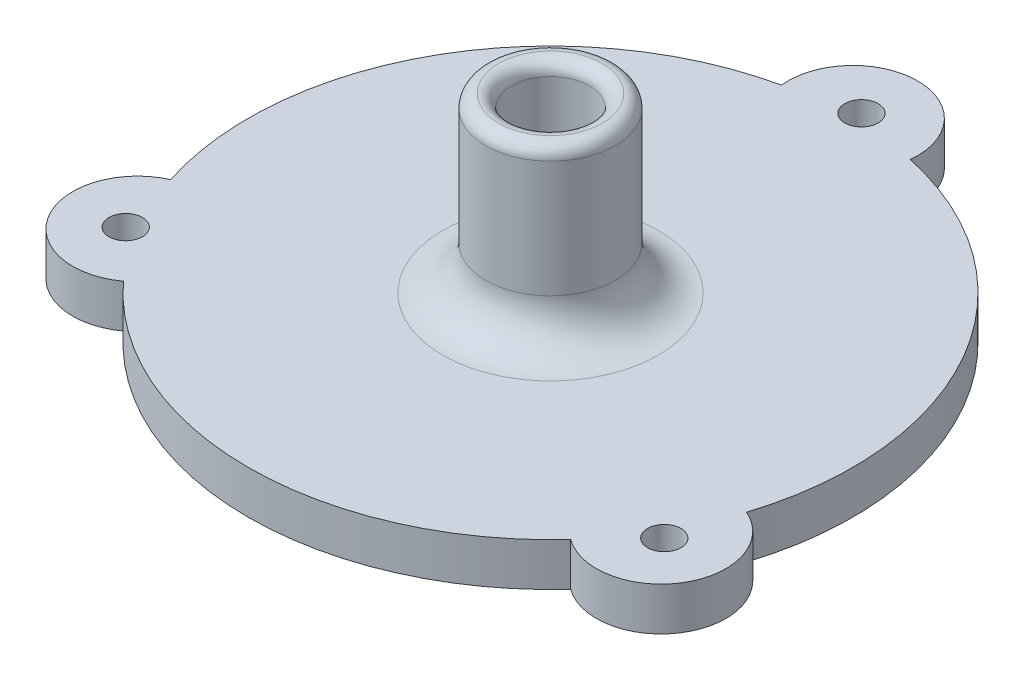
ISO-10303-21;
HEADER;
FILE_DESCRIPTION(('STEP AP214'),'2;1');
FILE_NAME('part.step','',(''),(''),'','','');
FILE_SCHEMA(('AUTOMOTIVE_DESIGN { 1 0 10303 214 1 1 1 1 }'));
ENDSEC;
DATA;
#1=APPLICATION_CONTEXT('core data for automotive mechanical design processes');
#2=APPLICATION_PROTOCOL_DEFINITION('international standard','automotive_design',2000,#1);
#3=PRODUCT_CONTEXT('',#1,'mechanical');
#4=PRODUCT('Part','Part','',(#3));
#5=PRODUCT_RELATED_PRODUCT_CATEGORY('part','',(#4));
#6=PRODUCT_DEFINITION_FORMATION('','',#4);
#7=PRODUCT_DEFINITION_CONTEXT('part definition',#1,'design');
#8=PRODUCT_DEFINITION('design','',#6,#7);
#9=PRODUCT_DEFINITION_SHAPE('','',#8);
#10=(LENGTH_UNIT() NAMED_UNIT(*) SI_UNIT(.MILLI.,.METRE.));
#11=(NAMED_UNIT(*) PLANE_ANGLE_UNIT() SI_UNIT($,.RADIAN.));
#12=(NAMED_UNIT(*) SI_UNIT($,.STERADIAN.) SOLID_ANGLE_UNIT());
#13=UNCERTAINTY_MEASURE_WITH_UNIT(LENGTH_MEASURE(1.E-05),#10,'distance_accuracy_value','');
#14=(GEOMETRIC_REPRESENTATION_CONTEXT(3) GLOBAL_UNCERTAINTY_ASSIGNED_CONTEXT((#13)) GLOBAL_UNIT_ASSIGNED_CONTEXT((#10,
#11,#12)) REPRESENTATION_CONTEXT('',''));
#15=CARTESIAN_POINT('',(0.,0.,0.));
#16=DIRECTION('',(0.,0.,1.));
#17=DIRECTION('',(1.,0.,0.));
#18=AXIS2_PLACEMENT_3D('',#15,#16,#17);
#19=CARTESIAN_POINT('',(0.,4.,0.));
#20=DIRECTION('',(0.,1.,0.));
#21=DIRECTION('',(0.,0.,1.));
#22=AXIS2_PLACEMENT_3D('',#19,#20,#21);
#23=PLANE('',#22);
#24=CARTESIAN_POINT('',(0.,4.,0.));
#25=DIRECTION('',(0.,1.,0.));
#26=DIRECTION('',(0.,0.,1.));
#27=AXIS2_PLACEMENT_3D('',#24,#25,#26);
#28=CIRCLE('',#27,10.);
#29=CARTESIAN_POINT('',(0.,4.,10.));
#30=VERTEX_POINT('',#29);
#31=EDGE_CURVE('E119',#30,#30,#28,.F.);
#32=ORIENTED_EDGE('',*,*,#31,.T.);
#33=EDGE_LOOP('',(#32));
#34=FACE_BOUND('',#33,.T.);
#35=CARTESIAN_POINT('',(0.,4.,0.));
#36=DIRECTION('',(0.,1.,0.));
#37=DIRECTION('',(0.,0.,1.));
#38=AXIS2_PLACEMENT_3D('',#35,#36,#37);
#39=CIRCLE('',#38,28.);
#40=CARTESIAN_POINT('',(-5.96546181731788,4.,-27.3571428571429));
#41=VERTEX_POINT('',#40);
#42=CARTESIAN_POINT('',(-26.6747115979048,4.,8.51232994946749));
#43=VERTEX_POINT('',#42);
#44=EDGE_CURVE('E114',#41,#43,#39,.T.);
#45=ORIENTED_EDGE('',*,*,#44,.T.);
#46=CARTESIAN_POINT('',(-24.2487113059625,4.,14.000000000001));
#47=DIRECTION('',(0.,1.,0.));
#48=DIRECTION('',(0.,0.,1.));
#49=AXIS2_PLACEMENT_3D('',#46,#47,#48);
#50=CIRCLE('',#49,6.00000000000228);
#51=CARTESIAN_POINT('',(-20.7092497805839,4.,18.8448129076779));
#52=VERTEX_POINT('',#51);
#53=EDGE_CURVE('E48',#43,#52,#50,.T.);
#54=ORIENTED_EDGE('',*,*,#53,.T.);
#55=CARTESIAN_POINT('',(20.709249780587,4.,18.8448129076745));
#56=VERTEX_POINT('',#55);
#57=EDGE_CURVE('E101',#52,#56,#39,.T.);
#58=ORIENTED_EDGE('',*,*,#57,.T.);
#59=CARTESIAN_POINT('',(24.2487113059661,4.,13.999999999999));
#60=DIRECTION('',(0.,1.,0.));
#61=DIRECTION('',(0.,0.,1.));
#62=AXIS2_PLACEMENT_3D('',#59,#60,#61);
#63=CIRCLE('',#62,6.00000000000154);
#64=CARTESIAN_POINT('',(26.6747115979056,4.,8.51232994946499));
#65=VERTEX_POINT('',#64);
#66=EDGE_CURVE('E54',#56,#65,#63,.T.);
#67=ORIENTED_EDGE('',*,*,#66,.T.);
#68=CARTESIAN_POINT('',(5.96546181731788,4.,-27.3571428571429));
#69=VERTEX_POINT('',#68);
#70=EDGE_CURVE('E110',#65,#69,#39,.T.);
#71=ORIENTED_EDGE('',*,*,#70,.T.);
#72=CARTESIAN_POINT('',(0.,4.,-28.));
#73=DIRECTION('',(0.,1.,0.));
#74=DIRECTION('',(0.,0.,1.));
#75=AXIS2_PLACEMENT_3D('',#72,#73,#74);
#76=CIRCLE('',#75,6.);
#77=EDGE_CURVE('E213',#69,#41,#76,.T.);
#78=ORIENTED_EDGE('',*,*,#77,.T.);
#79=EDGE_LOOP('',(#45,#54,#58,#67,#71,#78));
#80=FACE_BOUND('',#79,.T.);
#81=CARTESIAN_POINT('',(0.,4.,-28.8));
#82=DIRECTION('',(0.,1.,0.));
#83=DIRECTION('',(0.,0.,1.));
#84=AXIS2_PLACEMENT_3D('',#81,#82,#83);
#85=CIRCLE('',#84,1.55);
#86=CARTESIAN_POINT('',(0.,4.,-27.25));
#87=VERTEX_POINT('',#86);
#88=EDGE_CURVE('E235',#87,#87,#85,.T.);
#89=ORIENTED_EDGE('',*,*,#88,.F.);
#90=EDGE_LOOP('',(#89));
#91=FACE_BOUND('',#90,.T.);
#92=CARTESIAN_POINT('',(-24.94153162899,4.,14.4000000000011));
#93=DIRECTION('',(0.,1.,0.));
#94=DIRECTION('',(0.,0.,1.));
#95=AXIS2_PLACEMENT_3D('',#92,#93,#94);
#96=CIRCLE('',#95,1.55000000000233);
#97=CARTESIAN_POINT('',(-24.94153162899,4.,15.9500000000034));
#98=VERTEX_POINT('',#97);
#99=EDGE_CURVE('E130',#98,#98,#96,.T.);
#100=ORIENTED_EDGE('',*,*,#99,.F.);
#101=EDGE_LOOP('',(#100));
#102=FACE_BOUND('',#101,.T.);
#103=CARTESIAN_POINT('',(24.9415316289937,4.,14.3999999999989));
#104=DIRECTION('',(0.,1.,0.));
#105=DIRECTION('',(0.,0.,1.));
#106=AXIS2_PLACEMENT_3D('',#103,#104,#105);
#107=CIRCLE('',#106,1.55000000000158);
#108=CARTESIAN_POINT('',(24.9415316289937,4.,15.9500000000005));
#109=VERTEX_POINT('',#108);
#110=EDGE_CURVE('E241',#109,#109,#107,.T.);
#111=ORIENTED_EDGE('',*,*,#110,.F.);
#112=EDGE_LOOP('',(#111));
#113=FACE_BOUND('',#112,.T.);
#114=ADVANCED_FACE('F33',(#34,#80,#91,#102,#113),#23,.T.);
#115=CARTESIAN_POINT('',(0.,4.,0.));
#116=DIRECTION('',(0.,-1.,0.));
#117=DIRECTION('',(0.,0.,-1.));
#118=AXIS2_PLACEMENT_3D('',#115,#116,#117);
#119=CYLINDRICAL_SURFACE('',#118,28.);
#120=CARTESIAN_POINT('',(0.,0.,0.));
#121=DIRECTION('',(0.,1.,0.));
#122=DIRECTION('',(0.,0.,1.));
#123=AXIS2_PLACEMENT_3D('',#120,#121,#122);
#124=CIRCLE('',#123,28.);
#125=CARTESIAN_POINT('',(-5.96546181731788,0.,-27.3571428571429));
#126=VERTEX_POINT('',#125);
#127=CARTESIAN_POINT('',(-26.6747115979048,0.,8.51232994946749));
#128=VERTEX_POINT('',#127);
#129=EDGE_CURVE('E107',#126,#128,#124,.T.);
#130=ORIENTED_EDGE('',*,*,#129,.T.);
#131=DIRECTION('',(0.,1.,0.));
#132=VECTOR('',#131,1.);
#133=CARTESIAN_POINT('',(-26.6747115979048,2.,8.51232994946749));
#134=LINE('',#133,#132);
#135=EDGE_CURVE('E90',#128,#43,#134,.T.);
#136=ORIENTED_EDGE('',*,*,#135,.T.);
#137=ORIENTED_EDGE('',*,*,#44,.F.);
#138=DIRECTION('',(0.,1.,0.));
#139=VECTOR('',#138,1.);
#140=CARTESIAN_POINT('',(-5.96546181731788,2.,-27.3571428571429));
#141=LINE('',#140,#139);
#142=EDGE_CURVE('E221',#41,#126,#141,.F.);
#143=ORIENTED_EDGE('',*,*,#142,.T.);
#144=EDGE_LOOP('',(#130,#136,#137,#143));
#145=FACE_BOUND('',#144,.T.);
#146=ADVANCED_FACE('F147',(#145),#119,.T.);
#147=ORIENTED_EDGE('',*,*,#57,.F.);
#148=DIRECTION('',(0.,1.,0.));
#149=VECTOR('',#148,1.);
#150=CARTESIAN_POINT('',(-20.7092497805839,2.,18.8448129076779));
#151=LINE('',#150,#149);
#152=CARTESIAN_POINT('',(-20.7092497805839,0.,18.8448129076779));
#153=VERTEX_POINT('',#152);
#154=EDGE_CURVE('E87',#52,#153,#151,.F.);
#155=ORIENTED_EDGE('',*,*,#154,.T.);
#156=CARTESIAN_POINT('',(20.709249780587,0.,18.8448129076745));
#157=VERTEX_POINT('',#156);
#158=EDGE_CURVE('E99',#153,#157,#124,.T.);
#159=ORIENTED_EDGE('',*,*,#158,.T.);
#160=DIRECTION('',(0.,1.,0.));
#161=VECTOR('',#160,1.);
#162=CARTESIAN_POINT('',(20.709249780587,2.,18.8448129076745));
#163=LINE('',#162,#161);
#164=EDGE_CURVE('E211',#157,#56,#163,.T.);
#165=ORIENTED_EDGE('',*,*,#164,.T.);
#166=EDGE_LOOP('',(#147,#155,#159,#165));
#167=FACE_BOUND('',#166,.T.);
#168=ADVANCED_FACE('F97',(#167),#119,.T.);
#169=ORIENTED_EDGE('',*,*,#70,.F.);
#170=DIRECTION('',(0.,1.,0.));
#171=VECTOR('',#170,1.);
#172=CARTESIAN_POINT('',(26.6747115979056,2.,8.51232994946499));
#173=LINE('',#172,#171);
#174=CARTESIAN_POINT('',(26.6747115979056,0.,8.51232994946499));
#175=VERTEX_POINT('',#174);
#176=EDGE_CURVE('E214',#65,#175,#173,.F.);
#177=ORIENTED_EDGE('',*,*,#176,.T.);
#178=CARTESIAN_POINT('',(5.96546181731788,0.,-27.3571428571429));
#179=VERTEX_POINT('',#178);
#180=EDGE_CURVE('E108',#175,#179,#124,.T.);
#181=ORIENTED_EDGE('',*,*,#180,.T.);
#182=DIRECTION('',(0.,1.,0.));
#183=VECTOR('',#182,1.);
#184=CARTESIAN_POINT('',(5.96546181731788,2.,-27.3571428571429));
#185=LINE('',#184,#183);
#186=EDGE_CURVE('E111',#179,#69,#185,.T.);
#187=ORIENTED_EDGE('',*,*,#186,.T.);
#188=EDGE_LOOP('',(#169,#177,#181,#187));
#189=FACE_BOUND('',#188,.T.);
#190=ADVANCED_FACE('F157',(#189),#119,.T.);
#191=CARTESIAN_POINT('',(0.,0.,0.));
#192=DIRECTION('',(0.,1.,0.));
#193=DIRECTION('',(0.,0.,1.));
#194=AXIS2_PLACEMENT_3D('',#191,#192,#193);
#195=PLANE('',#194);
#196=CARTESIAN_POINT('',(0.,0.,0.));
#197=DIRECTION('',(0.,1.,0.));
#198=DIRECTION('',(0.,0.,1.));
#199=AXIS2_PLACEMENT_3D('',#196,#197,#198);
#200=CIRCLE('',#199,5.6);
#201=CARTESIAN_POINT('',(0.,0.,5.6));
#202=VERTEX_POINT('',#201);
#203=EDGE_CURVE('E41',#202,#202,#200,.T.);
#204=ORIENTED_EDGE('',*,*,#203,.T.);
#205=EDGE_LOOP('',(#204));
#206=FACE_BOUND('',#205,.T.);
#207=CARTESIAN_POINT('',(24.9415316289937,0.,14.3999999999989));
#208=DIRECTION('',(0.,1.,0.));
#209=DIRECTION('',(0.,0.,1.));
#210=AXIS2_PLACEMENT_3D('',#207,#208,#209);
#211=CIRCLE('',#210,1.55000000000158);
#212=CARTESIAN_POINT('',(24.9415316289937,0.,15.9500000000005));
#213=VERTEX_POINT('',#212);
#214=EDGE_CURVE('E243',#213,#213,#211,.T.);
#215=ORIENTED_EDGE('',*,*,#214,.T.);
#216=EDGE_LOOP('',(#215));
#217=FACE_BOUND('',#216,.T.);
#218=CARTESIAN_POINT('',(-24.94153162899,0.,14.4000000000011));
#219=DIRECTION('',(0.,1.,0.));
#220=DIRECTION('',(0.,0.,1.));
#221=AXIS2_PLACEMENT_3D('',#218,#219,#220);
#222=CIRCLE('',#221,1.55000000000233);
#223=CARTESIAN_POINT('',(-24.94153162899,0.,15.9500000000034));
#224=VERTEX_POINT('',#223);
#225=EDGE_CURVE('E244',#224,#224,#222,.T.);
#226=ORIENTED_EDGE('',*,*,#225,.T.);
#227=EDGE_LOOP('',(#226));
#228=FACE_BOUND('',#227,.T.);
#229=CARTESIAN_POINT('',(0.,0.,-28.8));
#230=DIRECTION('',(0.,1.,0.));
#231=DIRECTION('',(0.,0.,1.));
#232=AXIS2_PLACEMENT_3D('',#229,#230,#231);
#233=CIRCLE('',#232,1.55);
#234=CARTESIAN_POINT('',(0.,0.,-27.25));
#235=VERTEX_POINT('',#234);
#236=EDGE_CURVE('E252',#235,#235,#233,.T.);
#237=ORIENTED_EDGE('',*,*,#236,.T.);
#238=EDGE_LOOP('',(#237));
#239=FACE_BOUND('',#238,.T.);
#240=ORIENTED_EDGE('',*,*,#158,.F.);
#241=CARTESIAN_POINT('',(-24.2487113059625,0.,14.000000000001));
#242=DIRECTION('',(0.,1.,0.));
#243=DIRECTION('',(0.,0.,1.));
#244=AXIS2_PLACEMENT_3D('',#241,#242,#243);
#245=CIRCLE('',#244,6.00000000000228);
#246=EDGE_CURVE('E84',#128,#153,#245,.T.);
#247=ORIENTED_EDGE('',*,*,#246,.F.);
#248=ORIENTED_EDGE('',*,*,#129,.F.);
#249=CARTESIAN_POINT('',(0.,0.,-28.));
#250=DIRECTION('',(0.,1.,0.));
#251=DIRECTION('',(0.,0.,1.));
#252=AXIS2_PLACEMENT_3D('',#249,#250,#251);
#253=CIRCLE('',#252,6.);
#254=EDGE_CURVE('E216',#179,#126,#253,.T.);
#255=ORIENTED_EDGE('',*,*,#254,.F.);
#256=ORIENTED_EDGE('',*,*,#180,.F.);
#257=CARTESIAN_POINT('',(24.2487113059661,0.,13.999999999999));
#258=DIRECTION('',(0.,1.,0.));
#259=DIRECTION('',(0.,0.,1.));
#260=AXIS2_PLACEMENT_3D('',#257,#258,#259);
#261=CIRCLE('',#260,6.00000000000154);
#262=EDGE_CURVE('E106',#157,#175,#261,.T.);
#263=ORIENTED_EDGE('',*,*,#262,.F.);
#264=EDGE_LOOP('',(#240,#247,#248,#255,#256,#263));
#265=FACE_BOUND('',#264,.T.);
#266=ADVANCED_FACE('F104',(#206,#217,#228,#239,#265),#195,.F.);
#267=CARTESIAN_POINT('',(0.,0.,-28.));
#268=DIRECTION('',(0.,1.,0.));
#269=DIRECTION('',(0.,0.,1.));
#270=AXIS2_PLACEMENT_3D('',#267,#268,#269);
#271=CYLINDRICAL_SURFACE('',#270,6.);
#272=ORIENTED_EDGE('',*,*,#186,.F.);
#273=ORIENTED_EDGE('',*,*,#254,.T.);
#274=ORIENTED_EDGE('',*,*,#142,.F.);
#275=ORIENTED_EDGE('',*,*,#77,.F.);
#276=EDGE_LOOP('',(#272,#273,#274,#275));
#277=FACE_BOUND('',#276,.T.);
#278=ADVANCED_FACE('F160',(#277),#271,.T.);
#279=CARTESIAN_POINT('',(24.2487113059661,0.,13.999999999999));
#280=DIRECTION('',(0.,1.,0.));
#281=DIRECTION('',(0.,0.,1.));
#282=AXIS2_PLACEMENT_3D('',#279,#280,#281);
#283=CYLINDRICAL_SURFACE('',#282,6.00000000000154);
#284=ORIENTED_EDGE('',*,*,#164,.F.);
#285=ORIENTED_EDGE('',*,*,#262,.T.);
#286=ORIENTED_EDGE('',*,*,#176,.F.);
#287=ORIENTED_EDGE('',*,*,#66,.F.);
#288=EDGE_LOOP('',(#284,#285,#286,#287));
#289=FACE_BOUND('',#288,.T.);
#290=ADVANCED_FACE('F204',(#289),#283,.T.);
#291=CARTESIAN_POINT('',(-24.2487113059625,0.,14.000000000001));
#292=DIRECTION('',(0.,1.,0.));
#293=DIRECTION('',(0.,0.,1.));
#294=AXIS2_PLACEMENT_3D('',#291,#292,#293);
#295=CYLINDRICAL_SURFACE('',#294,6.00000000000228);
#296=ORIENTED_EDGE('',*,*,#135,.F.);
#297=ORIENTED_EDGE('',*,*,#246,.T.);
#298=ORIENTED_EDGE('',*,*,#154,.F.);
#299=ORIENTED_EDGE('',*,*,#53,.F.);
#300=EDGE_LOOP('',(#296,#297,#298,#299));
#301=FACE_BOUND('',#300,.T.);
#302=ADVANCED_FACE('F86',(#301),#295,.T.);
#303=CARTESIAN_POINT('',(0.,0.,-28.8));
#304=DIRECTION('',(0.,1.,0.));
#305=DIRECTION('',(0.,0.,1.));
#306=AXIS2_PLACEMENT_3D('',#303,#304,#305);
#307=CYLINDRICAL_SURFACE('',#306,1.55);
#308=ORIENTED_EDGE('',*,*,#236,.F.);
#309=EDGE_LOOP('',(#308));
#310=FACE_BOUND('',#309,.T.);
#311=ORIENTED_EDGE('',*,*,#88,.T.);
#312=EDGE_LOOP('',(#311));
#313=FACE_BOUND('',#312,.T.);
#314=ADVANCED_FACE('F198',(#310,#313),#307,.F.);
#315=CARTESIAN_POINT('',(-24.94153162899,0.,14.4000000000011));
#316=DIRECTION('',(0.,1.,0.));
#317=DIRECTION('',(0.,0.,1.));
#318=AXIS2_PLACEMENT_3D('',#315,#316,#317);
#319=CYLINDRICAL_SURFACE('',#318,1.55000000000233);
#320=ORIENTED_EDGE('',*,*,#225,.F.);
#321=EDGE_LOOP('',(#320));
#322=FACE_BOUND('',#321,.T.);
#323=ORIENTED_EDGE('',*,*,#99,.T.);
#324=EDGE_LOOP('',(#323));
#325=FACE_BOUND('',#324,.T.);
#326=ADVANCED_FACE('F192',(#322,#325),#319,.F.);
#327=CARTESIAN_POINT('',(24.9415316289937,0.,14.3999999999989));
#328=DIRECTION('',(0.,1.,0.));
#329=DIRECTION('',(0.,0.,1.));
#330=AXIS2_PLACEMENT_3D('',#327,#328,#329);
#331=CYLINDRICAL_SURFACE('',#330,1.55000000000158);
#332=ORIENTED_EDGE('',*,*,#214,.F.);
#333=EDGE_LOOP('',(#332));
#334=FACE_BOUND('',#333,.T.);
#335=ORIENTED_EDGE('',*,*,#110,.T.);
#336=EDGE_LOOP('',(#335));
#337=FACE_BOUND('',#336,.T.);
#338=ADVANCED_FACE('F182',(#334,#337),#331,.F.);
#339=CARTESIAN_POINT('',(0.,0.,0.));
#340=DIRECTION('',(0.,1.,0.));
#341=DIRECTION('',(0.,0.,1.));
#342=AXIS2_PLACEMENT_3D('',#339,#340,#341);
#343=CYLINDRICAL_SURFACE('',#342,3.6);
#344=CARTESIAN_POINT('',(0.,2.,0.));
#345=DIRECTION('',(0.,1.,0.));
#346=DIRECTION('',(0.,0.,1.));
#347=AXIS2_PLACEMENT_3D('',#344,#345,#346);
#348=CIRCLE('',#347,3.6);
#349=CARTESIAN_POINT('',(0.,2.,3.6));
#350=VERTEX_POINT('',#349);
#351=EDGE_CURVE('E11',#350,#350,#348,.F.);
#352=ORIENTED_EDGE('',*,*,#351,.T.);
#353=EDGE_LOOP('',(#352));
#354=FACE_BOUND('',#353,.T.);
#355=CARTESIAN_POINT('',(0.,18.8,0.));
#356=DIRECTION('',(0.,1.,0.));
#357=DIRECTION('',(0.,0.,1.));
#358=AXIS2_PLACEMENT_3D('',#355,#356,#357);
#359=CIRCLE('',#358,3.6);
#360=CARTESIAN_POINT('',(0.,18.8,3.6));
#361=VERTEX_POINT('',#360);
#362=EDGE_CURVE('E122',#361,#361,#359,.T.);
#363=ORIENTED_EDGE('',*,*,#362,.T.);
#364=EDGE_LOOP('',(#363));
#365=FACE_BOUND('',#364,.T.);
#366=ADVANCED_FACE('F180',(#354,#365),#343,.F.);
#367=CARTESIAN_POINT('',(0.,20.,0.));
#368=DIRECTION('',(0.,-1.,0.));
#369=DIRECTION('',(0.,0.,-1.));
#370=AXIS2_PLACEMENT_3D('',#367,#368,#369);
#371=CYLINDRICAL_SURFACE('',#370,6.);
#372=CARTESIAN_POINT('',(0.,18.8,0.));
#373=DIRECTION('',(0.,1.,0.));
#374=DIRECTION('',(0.,0.,1.));
#375=AXIS2_PLACEMENT_3D('',#372,#373,#374);
#376=CIRCLE('',#375,6.);
#377=CARTESIAN_POINT('',(0.,18.8,6.));
#378=VERTEX_POINT('',#377);
#379=EDGE_CURVE('E125',#378,#378,#376,.F.);
#380=ORIENTED_EDGE('',*,*,#379,.T.);
#381=EDGE_LOOP('',(#380));
#382=FACE_BOUND('',#381,.T.);
#383=CARTESIAN_POINT('',(0.,8.,0.));
#384=DIRECTION('',(0.,1.,0.));
#385=DIRECTION('',(0.,0.,1.));
#386=AXIS2_PLACEMENT_3D('',#383,#384,#385);
#387=CIRCLE('',#386,6.);
#388=CARTESIAN_POINT('',(0.,8.,6.));
#389=VERTEX_POINT('',#388);
#390=EDGE_CURVE('E116',#389,#389,#387,.T.);
#391=ORIENTED_EDGE('',*,*,#390,.T.);
#392=EDGE_LOOP('',(#391));
#393=FACE_BOUND('',#392,.T.);
#394=ADVANCED_FACE('F168',(#382,#393),#371,.T.);
#395=CARTESIAN_POINT('',(0.,8.,0.));
#396=DIRECTION('',(0.,1.,0.));
#397=DIRECTION('',(0.,0.,1.));
#398=AXIS2_PLACEMENT_3D('',#395,#396,#397);
#399=TOROIDAL_SURFACE('',#398,10.,4.);
#400=ORIENTED_EDGE('',*,*,#31,.F.);
#401=EDGE_LOOP('',(#400));
#402=FACE_BOUND('',#401,.T.);
#403=ORIENTED_EDGE('',*,*,#390,.F.);
#404=EDGE_LOOP('',(#403));
#405=FACE_BOUND('',#404,.T.);
#406=ADVANCED_FACE('F166',(#402,#405),#399,.F.);
#407=CARTESIAN_POINT('',(0.,18.8,0.));
#408=DIRECTION('',(0.,1.,0.));
#409=DIRECTION('',(0.,0.,1.));
#410=AXIS2_PLACEMENT_3D('',#407,#408,#409);
#411=TOROIDAL_SURFACE('',#410,4.8,1.2);
#412=ORIENTED_EDGE('',*,*,#379,.F.);
#413=EDGE_LOOP('',(#412));
#414=FACE_BOUND('',#413,.T.);
#415=CARTESIAN_POINT('',(0.,20.,0.));
#416=DIRECTION('',(0.,1.,0.));
#417=DIRECTION('',(0.,0.,1.));
#418=AXIS2_PLACEMENT_3D('',#415,#416,#417);
#419=CIRCLE('',#418,4.8);
#420=CARTESIAN_POINT('',(0.,20.,4.8));
#421=VERTEX_POINT('',#420);
#422=EDGE_CURVE('E128',#421,#421,#419,.T.);
#423=ORIENTED_EDGE('',*,*,#422,.F.);
#424=EDGE_LOOP('',(#423));
#425=FACE_BOUND('',#424,.T.);
#426=ADVANCED_FACE('F142',(#414,#425),#411,.T.);
#427=CARTESIAN_POINT('',(0.,18.8,0.));
#428=DIRECTION('',(0.,1.,0.));
#429=DIRECTION('',(0.,0.,1.));
#430=AXIS2_PLACEMENT_3D('',#427,#428,#429);
#431=TOROIDAL_SURFACE('',#430,4.8,1.2);
#432=ORIENTED_EDGE('',*,*,#422,.T.);
#433=EDGE_LOOP('',(#432));
#434=FACE_BOUND('',#433,.T.);
#435=ORIENTED_EDGE('',*,*,#362,.F.);
#436=EDGE_LOOP('',(#435));
#437=FACE_BOUND('',#436,.T.);
#438=ADVANCED_FACE('F137',(#434,#437),#431,.T.);
#439=CARTESIAN_POINT('',(0.,2.,0.));
#440=DIRECTION('',(0.,1.,0.));
#441=DIRECTION('',(0.,0.,1.));
#442=AXIS2_PLACEMENT_3D('',#439,#440,#441);
#443=TOROIDAL_SURFACE('',#442,5.6,2.);
#444=ORIENTED_EDGE('',*,*,#351,.F.);
#445=EDGE_LOOP('',(#444));
#446=FACE_BOUND('',#445,.T.);
#447=ORIENTED_EDGE('',*,*,#203,.F.);
#448=EDGE_LOOP('',(#447));
#449=FACE_BOUND('',#448,.T.);
#450=ADVANCED_FACE('F35',(#446,#449),#443,.T.);
#451=CLOSED_SHELL('',(#114,#146,#168,#190,#266,#278,#290,#302,#314,#326,#338,#366,#394,#406,
#426,#438,#450));
#452=MANIFOLD_SOLID_BREP('B2',#451);
#453=ADVANCED_BREP_SHAPE_REPRESENTATION('',(#18,#452),#14);
#454=SHAPE_DEFINITION_REPRESENTATION(#9,#453);
ENDSEC;
END-ISO-10303-21;
